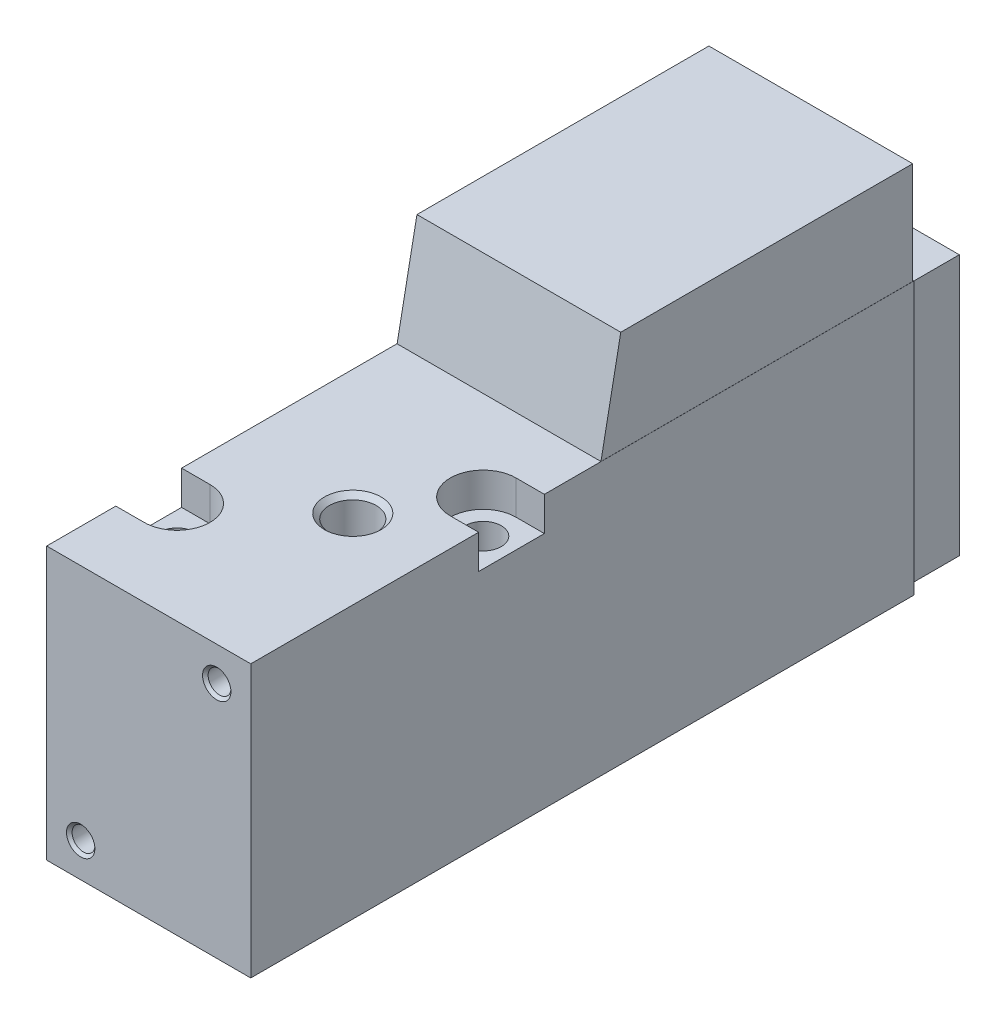
ISO-10303-21;
HEADER;
FILE_DESCRIPTION(('STEP AP214'),'2;1');
FILE_NAME('part.step','',(''),(''),'','','');
FILE_SCHEMA(('AUTOMOTIVE_DESIGN { 1 0 10303 214 1 1 1 1 }'));
ENDSEC;
DATA;
#1=APPLICATION_CONTEXT('core data for automotive mechanical design processes');
#2=APPLICATION_PROTOCOL_DEFINITION('international standard','automotive_design',2000,#1);
#3=PRODUCT_CONTEXT('',#1,'mechanical');
#4=PRODUCT('Part','Part','',(#3));
#5=PRODUCT_RELATED_PRODUCT_CATEGORY('part','',(#4));
#6=PRODUCT_DEFINITION_FORMATION('','',#4);
#7=PRODUCT_DEFINITION_CONTEXT('part definition',#1,'design');
#8=PRODUCT_DEFINITION('design','',#6,#7);
#9=PRODUCT_DEFINITION_SHAPE('','',#8);
#10=(LENGTH_UNIT() NAMED_UNIT(*) SI_UNIT(.MILLI.,.METRE.));
#11=(NAMED_UNIT(*) PLANE_ANGLE_UNIT() SI_UNIT($,.RADIAN.));
#12=(NAMED_UNIT(*) SI_UNIT($,.STERADIAN.) SOLID_ANGLE_UNIT());
#13=UNCERTAINTY_MEASURE_WITH_UNIT(LENGTH_MEASURE(1.E-05),#10,'distance_accuracy_value','');
#14=(GEOMETRIC_REPRESENTATION_CONTEXT(3) GLOBAL_UNCERTAINTY_ASSIGNED_CONTEXT((#13)) GLOBAL_UNIT_ASSIGNED_CONTEXT((#10,
#11,#12)) REPRESENTATION_CONTEXT('',''));
#15=CARTESIAN_POINT('',(0.,0.,0.));
#16=DIRECTION('',(0.,0.,1.));
#17=DIRECTION('',(1.,0.,0.));
#18=AXIS2_PLACEMENT_3D('',#15,#16,#17);
#19=CARTESIAN_POINT('',(0.,-6.5,-20.9675));
#20=DIRECTION('',(0.,1.,0.));
#21=DIRECTION('',(0.,0.,1.));
#22=AXIS2_PLACEMENT_3D('',#19,#20,#21);
#23=PLANE('',#22);
#24=CARTESIAN_POINT('',(0.,-6.5,-22.));
#25=DIRECTION('',(0.,1.,0.));
#26=DIRECTION('',(0.,0.,1.));
#27=AXIS2_PLACEMENT_3D('',#24,#25,#26);
#28=CIRCLE('',#27,2.065);
#29=CARTESIAN_POINT('',(0.,-6.5,-19.935));
#30=VERTEX_POINT('',#29);
#31=EDGE_CURVE('E18',#30,#30,#28,.F.);
#32=ORIENTED_EDGE('',*,*,#31,.T.);
#33=EDGE_LOOP('',(#32));
#34=FACE_BOUND('',#33,.T.);
#35=ADVANCED_FACE('F15',(#34),#23,.F.);
#36=CARTESIAN_POINT('',(0.,-6.5,-10.6675));
#37=DIRECTION('',(0.,1.,0.));
#38=DIRECTION('',(0.,0.,1.));
#39=AXIS2_PLACEMENT_3D('',#36,#37,#38);
#40=PLANE('',#39);
#41=CARTESIAN_POINT('',(0.,-6.5,-11.7));
#42=DIRECTION('',(0.,1.,0.));
#43=DIRECTION('',(0.,0.,1.));
#44=AXIS2_PLACEMENT_3D('',#41,#42,#43);
#45=CIRCLE('',#44,2.065);
#46=CARTESIAN_POINT('',(0.,-6.5,-9.635));
#47=VERTEX_POINT('',#46);
#48=EDGE_CURVE('E285',#47,#47,#45,.F.);
#49=ORIENTED_EDGE('',*,*,#48,.T.);
#50=EDGE_LOOP('',(#49));
#51=FACE_BOUND('',#50,.T.);
#52=ADVANCED_FACE('F487',(#51),#40,.F.);
#53=CARTESIAN_POINT('',(6.,9.,-3.00000000009959));
#54=DIRECTION('',(0.,0.,1.));
#55=DIRECTION('',(1.,0.,0.));
#56=AXIS2_PLACEMENT_3D('',#53,#54,#55);
#57=CONICAL_SURFACE('',#56,1.00499999982139,1.04719755088058);
#58=CARTESIAN_POINT('',(6.,9.,-3.));
#59=DIRECTION('',(0.,0.,-1.));
#60=DIRECTION('',(-1.,0.,0.));
#61=AXIS2_PLACEMENT_3D('',#58,#59,#60);
#62=CIRCLE('',#61,1.005);
#63=CARTESIAN_POINT('',(4.995,9.,-3.));
#64=VERTEX_POINT('',#63);
#65=EDGE_CURVE('E282',#64,#64,#62,.F.);
#66=ORIENTED_EDGE('',*,*,#65,.T.);
#67=EDGE_LOOP('',(#66));
#68=FACE_BOUND('',#67,.T.);
#69=CARTESIAN_POINT('',(5.99999999968759,9.,-3.58023702062837));
#70=VERTEX_POINT('',#69);
#71=VERTEX_LOOP('',#70);
#72=FACE_BOUND('',#71,.T.);
#73=ADVANCED_FACE('F484',(#68,#72),#57,.F.);
#74=CARTESIAN_POINT('',(-6.,-9.,-3.00000000004275));
#75=DIRECTION('',(0.,0.,1.));
#76=DIRECTION('',(0.,-1.,0.));
#77=AXIS2_PLACEMENT_3D('',#74,#75,#76);
#78=CONICAL_SURFACE('',#77,1.00499999999238,1.04719755111932);
#79=CARTESIAN_POINT('',(-6.,-9.,-3.));
#80=DIRECTION('',(0.,0.,-1.));
#81=DIRECTION('',(-1.,0.,0.));
#82=AXIS2_PLACEMENT_3D('',#79,#80,#81);
#83=CIRCLE('',#82,1.005);
#84=CARTESIAN_POINT('',(-7.005,-9.,-3.));
#85=VERTEX_POINT('',#84);
#86=EDGE_CURVE('E279',#85,#85,#83,.F.);
#87=ORIENTED_EDGE('',*,*,#86,.T.);
#88=EDGE_LOOP('',(#87));
#89=FACE_BOUND('',#88,.T.);
#90=CARTESIAN_POINT('',(-6.00000000014234,-9.,-3.58023702059995));
#91=VERTEX_POINT('',#90);
#92=VERTEX_LOOP('',#91);
#93=FACE_BOUND('',#92,.T.);
#94=ADVANCED_FACE('F480',(#89,#93),#78,.F.);
#95=CARTESIAN_POINT('',(2.,6.5,-14.9675));
#96=DIRECTION('',(0.,-1.,0.));
#97=DIRECTION('',(0.,0.,-1.));
#98=AXIS2_PLACEMENT_3D('',#95,#96,#97);
#99=PLANE('',#98);
#100=CARTESIAN_POINT('',(2.,6.5,-16.));
#101=DIRECTION('',(0.,1.,0.));
#102=DIRECTION('',(0.,0.,1.));
#103=AXIS2_PLACEMENT_3D('',#100,#101,#102);
#104=CIRCLE('',#103,2.065);
#105=CARTESIAN_POINT('',(2.,6.5,-13.935));
#106=VERTEX_POINT('',#105);
#107=EDGE_CURVE('E244',#106,#106,#104,.T.);
#108=ORIENTED_EDGE('',*,*,#107,.T.);
#109=EDGE_LOOP('',(#108));
#110=FACE_BOUND('',#109,.T.);
#111=ADVANCED_FACE('F476',(#110),#99,.F.);
#112=CARTESIAN_POINT('',(0.,0.,-63.));
#113=DIRECTION('',(0.,0.,1.));
#114=DIRECTION('',(1.,0.,0.));
#115=AXIS2_PLACEMENT_3D('',#112,#113,#114);
#116=PLANE('',#115);
#117=DIRECTION('',(1.,0.,0.));
#118=VECTOR('',#117,1.);
#119=CARTESIAN_POINT('',(-8.5,-11.5,-63.));
#120=LINE('',#119,#118);
#121=CARTESIAN_POINT('',(-8.5,-11.5,-63.));
#122=VERTEX_POINT('',#121);
#123=CARTESIAN_POINT('',(8.5,-11.5,-63.));
#124=VERTEX_POINT('',#123);
#125=EDGE_CURVE('E241',#122,#124,#120,.T.);
#126=ORIENTED_EDGE('',*,*,#125,.F.);
#127=DIRECTION('',(0.,1.,0.));
#128=VECTOR('',#127,1.);
#129=CARTESIAN_POINT('',(-8.5,11.5,-63.));
#130=LINE('',#129,#128);
#131=CARTESIAN_POINT('',(-8.5,11.5,-63.));
#132=VERTEX_POINT('',#131);
#133=EDGE_CURVE('E238',#132,#122,#130,.F.);
#134=ORIENTED_EDGE('',*,*,#133,.F.);
#135=DIRECTION('',(1.,0.,0.));
#136=VECTOR('',#135,1.);
#137=CARTESIAN_POINT('',(8.5,11.5,-63.));
#138=LINE('',#137,#136);
#139=CARTESIAN_POINT('',(8.5,11.5,-63.));
#140=VERTEX_POINT('',#139);
#141=EDGE_CURVE('E232',#140,#132,#138,.F.);
#142=ORIENTED_EDGE('',*,*,#141,.F.);
#143=DIRECTION('',(0.,1.,0.));
#144=VECTOR('',#143,1.);
#145=CARTESIAN_POINT('',(8.5,-11.5,-63.));
#146=LINE('',#145,#144);
#147=EDGE_CURVE('E226',#124,#140,#146,.T.);
#148=ORIENTED_EDGE('',*,*,#147,.F.);
#149=EDGE_LOOP('',(#126,#134,#142,#148));
#150=FACE_BOUND('',#149,.T.);
#151=ADVANCED_FACE('F341',(#150),#116,.F.);
#152=CARTESIAN_POINT('',(0.,-9.0025,-22.));
#153=DIRECTION('',(0.,1.,0.));
#154=DIRECTION('',(0.,0.,1.));
#155=AXIS2_PLACEMENT_3D('',#152,#153,#154);
#156=CYLINDRICAL_SURFACE('',#155,2.065);
#157=ORIENTED_EDGE('',*,*,#31,.F.);
#158=EDGE_LOOP('',(#157));
#159=FACE_BOUND('',#158,.T.);
#160=CARTESIAN_POINT('',(0.,-11.5049999999428,-22.));
#161=DIRECTION('',(0.,-1.,0.));
#162=DIRECTION('',(0.,0.,1.));
#163=AXIS2_PLACEMENT_3D('',#160,#161,#162);
#164=CIRCLE('',#163,2.06499999996777);
#165=CARTESIAN_POINT('',(0.,-11.5049999999428,-19.9350000000322));
#166=VERTEX_POINT('',#165);
#167=EDGE_CURVE('E276',#166,#166,#164,.T.);
#168=ORIENTED_EDGE('',*,*,#167,.T.);
#169=EDGE_LOOP('',(#168));
#170=FACE_BOUND('',#169,.T.);
#171=ADVANCED_FACE('F337',(#159,#170),#156,.F.);
#172=CARTESIAN_POINT('',(0.,-9.0025,-11.7));
#173=DIRECTION('',(0.,1.,0.));
#174=DIRECTION('',(0.,0.,1.));
#175=AXIS2_PLACEMENT_3D('',#172,#173,#174);
#176=CYLINDRICAL_SURFACE('',#175,2.065);
#177=ORIENTED_EDGE('',*,*,#48,.F.);
#178=EDGE_LOOP('',(#177));
#179=FACE_BOUND('',#178,.T.);
#180=CARTESIAN_POINT('',(0.,-11.5049999999997,-11.7));
#181=DIRECTION('',(0.,-1.,0.));
#182=DIRECTION('',(0.,0.,1.));
#183=AXIS2_PLACEMENT_3D('',#180,#181,#182);
#184=CIRCLE('',#183,2.06499999999705);
#185=CARTESIAN_POINT('',(0.,-11.5049999999997,-9.63500000000295));
#186=VERTEX_POINT('',#185);
#187=EDGE_CURVE('E273',#186,#186,#184,.T.);
#188=ORIENTED_EDGE('',*,*,#187,.T.);
#189=EDGE_LOOP('',(#188));
#190=FACE_BOUND('',#189,.T.);
#191=ADVANCED_FACE('F340',(#179,#190),#176,.F.);
#192=CARTESIAN_POINT('',(6.,9.,-1.6225));
#193=DIRECTION('',(0.,0.,-1.));
#194=DIRECTION('',(-1.,0.,0.));
#195=AXIS2_PLACEMENT_3D('',#192,#193,#194);
#196=CYLINDRICAL_SURFACE('',#195,1.005);
#197=ORIENTED_EDGE('',*,*,#65,.F.);
#198=EDGE_LOOP('',(#197));
#199=FACE_BOUND('',#198,.T.);
#200=CARTESIAN_POINT('',(6.,9.,-0.245000000006712));
#201=DIRECTION('',(0.,0.,1.));
#202=DIRECTION('',(-1.,0.,0.));
#203=AXIS2_PLACEMENT_3D('',#200,#201,#202);
#204=CIRCLE('',#203,1.00499999999192);
#205=CARTESIAN_POINT('',(4.99500000000808,9.,-0.245000000006712));
#206=VERTEX_POINT('',#205);
#207=EDGE_CURVE('E270',#206,#206,#204,.T.);
#208=ORIENTED_EDGE('',*,*,#207,.T.);
#209=EDGE_LOOP('',(#208));
#210=FACE_BOUND('',#209,.T.);
#211=ADVANCED_FACE('F463',(#199,#210),#196,.F.);
#212=CARTESIAN_POINT('',(-6.,-9.,-1.6225));
#213=DIRECTION('',(0.,0.,-1.));
#214=DIRECTION('',(-1.,0.,0.));
#215=AXIS2_PLACEMENT_3D('',#212,#213,#214);
#216=CYLINDRICAL_SURFACE('',#215,1.005);
#217=ORIENTED_EDGE('',*,*,#86,.F.);
#218=EDGE_LOOP('',(#217));
#219=FACE_BOUND('',#218,.T.);
#220=CARTESIAN_POINT('',(-6.,-9.,-0.244999999949869));
#221=DIRECTION('',(0.,0.,1.));
#222=DIRECTION('',(-1.,0.,0.));
#223=AXIS2_PLACEMENT_3D('',#220,#221,#222);
#224=CIRCLE('',#223,1.00500000004922);
#225=CARTESIAN_POINT('',(-7.00500000004922,-9.,-0.244999999949869));
#226=VERTEX_POINT('',#225);
#227=EDGE_CURVE('E218',#226,#226,#224,.T.);
#228=ORIENTED_EDGE('',*,*,#227,.T.);
#229=EDGE_LOOP('',(#228));
#230=FACE_BOUND('',#229,.T.);
#231=ADVANCED_FACE('F469',(#219,#230),#216,.F.);
#232=CARTESIAN_POINT('',(8.99,21.,-58.4));
#233=DIRECTION('',(0.,1.,0.));
#234=DIRECTION('',(0.,0.,1.));
#235=AXIS2_PLACEMENT_3D('',#232,#233,#234);
#236=PLANE('',#235);
#237=DIRECTION('',(0.,0.,-1.));
#238=VECTOR('',#237,1.);
#239=CARTESIAN_POINT('',(8.99,21.,0.));
#240=LINE('',#239,#238);
#241=CARTESIAN_POINT('',(8.99,21.,-58.4));
#242=VERTEX_POINT('',#241);
#243=CARTESIAN_POINT('',(8.99,21.,-32.6494227822395));
#244=VERTEX_POINT('',#243);
#245=EDGE_CURVE('E200',#242,#244,#240,.F.);
#246=ORIENTED_EDGE('',*,*,#245,.F.);
#247=DIRECTION('',(-1.,0.,0.));
#248=VECTOR('',#247,1.);
#249=CARTESIAN_POINT('',(8.99,21.,-58.4));
#250=LINE('',#249,#248);
#251=CARTESIAN_POINT('',(-8.99,21.,-58.4));
#252=VERTEX_POINT('',#251);
#253=EDGE_CURVE('E206',#252,#242,#250,.F.);
#254=ORIENTED_EDGE('',*,*,#253,.F.);
#255=DIRECTION('',(0.,0.,-1.));
#256=VECTOR('',#255,1.);
#257=CARTESIAN_POINT('',(-8.99,21.,0.));
#258=LINE('',#257,#256);
#259=CARTESIAN_POINT('',(-8.99,21.,-32.6494227822395));
#260=VERTEX_POINT('',#259);
#261=EDGE_CURVE('E213',#252,#260,#258,.F.);
#262=ORIENTED_EDGE('',*,*,#261,.T.);
#263=DIRECTION('',(1.,0.,0.));
#264=VECTOR('',#263,1.);
#265=CARTESIAN_POINT('',(8.99,21.,-32.6494227822395));
#266=LINE('',#265,#264);
#267=EDGE_CURVE('E215',#244,#260,#266,.F.);
#268=ORIENTED_EDGE('',*,*,#267,.F.);
#269=EDGE_LOOP('',(#246,#254,#262,#268));
#270=FACE_BOUND('',#269,.T.);
#271=ADVANCED_FACE('F535',(#270),#236,.T.);
#272=CARTESIAN_POINT('',(2.,9.03250000000001,-16.));
#273=DIRECTION('',(0.,1.,0.));
#274=DIRECTION('',(0.,0.,1.));
#275=AXIS2_PLACEMENT_3D('',#272,#273,#274);
#276=CYLINDRICAL_SURFACE('',#275,2.065);
#277=ORIENTED_EDGE('',*,*,#107,.F.);
#278=EDGE_LOOP('',(#277));
#279=FACE_BOUND('',#278,.T.);
#280=CARTESIAN_POINT('',(2.,11.5649999999619,-16.));
#281=DIRECTION('',(0.,1.,0.));
#282=DIRECTION('',(0.,0.,1.));
#283=AXIS2_PLACEMENT_3D('',#280,#281,#282);
#284=CIRCLE('',#283,2.06499999999642);
#285=CARTESIAN_POINT('',(2.,11.5649999999619,-13.9350000000036));
#286=VERTEX_POINT('',#285);
#287=EDGE_CURVE('E174',#286,#286,#284,.T.);
#288=ORIENTED_EDGE('',*,*,#287,.T.);
#289=EDGE_LOOP('',(#288));
#290=FACE_BOUND('',#289,.T.);
#291=ADVANCED_FACE('F542',(#279,#290),#276,.F.);
#292=CARTESIAN_POINT('',(0.,9.,0.));
#293=DIRECTION('',(0.,1.,0.));
#294=DIRECTION('',(0.,0.,1.));
#295=AXIS2_PLACEMENT_3D('',#292,#293,#294);
#296=PLANE('',#295);
#297=CARTESIAN_POINT('',(6.5,9.,-23.));
#298=DIRECTION('',(0.,1.,0.));
#299=DIRECTION('',(0.,0.,1.));
#300=AXIS2_PLACEMENT_3D('',#297,#298,#299);
#301=CIRCLE('',#300,2.9);
#302=CARTESIAN_POINT('',(6.5,9.,-25.9));
#303=VERTEX_POINT('',#302);
#304=CARTESIAN_POINT('',(6.5,9.,-20.1));
#305=VERTEX_POINT('',#304);
#306=EDGE_CURVE('E157',#303,#305,#301,.T.);
#307=ORIENTED_EDGE('',*,*,#306,.T.);
#308=DIRECTION('',(1.,0.,0.));
#309=VECTOR('',#308,1.);
#310=CARTESIAN_POINT('',(6.5,9.,-20.1));
#311=LINE('',#310,#309);
#312=CARTESIAN_POINT('',(9.,9.,-20.1));
#313=VERTEX_POINT('',#312);
#314=EDGE_CURVE('E161',#305,#313,#311,.T.);
#315=ORIENTED_EDGE('',*,*,#314,.T.);
#316=DIRECTION('',(0.,0.,-1.));
#317=VECTOR('',#316,1.);
#318=CARTESIAN_POINT('',(9.,9.,0.));
#319=LINE('',#318,#317);
#320=CARTESIAN_POINT('',(9.,9.,-25.9));
#321=VERTEX_POINT('',#320);
#322=EDGE_CURVE('E259',#321,#313,#319,.F.);
#323=ORIENTED_EDGE('',*,*,#322,.F.);
#324=DIRECTION('',(-1.,0.,0.));
#325=VECTOR('',#324,1.);
#326=CARTESIAN_POINT('',(10.,9.,-25.9));
#327=LINE('',#326,#325);
#328=EDGE_CURVE('E155',#321,#303,#327,.T.);
#329=ORIENTED_EDGE('',*,*,#328,.T.);
#330=EDGE_LOOP('',(#307,#315,#323,#329));
#331=FACE_BOUND('',#330,.T.);
#332=CARTESIAN_POINT('',(6.49999999999999,9.,-23.));
#333=DIRECTION('',(0.,1.,0.));
#334=DIRECTION('',(0.,0.,1.));
#335=AXIS2_PLACEMENT_3D('',#332,#333,#334);
#336=CIRCLE('',#335,1.6);
#337=CARTESIAN_POINT('',(6.49999999999999,9.,-21.4));
#338=VERTEX_POINT('',#337);
#339=EDGE_CURVE('E222',#338,#338,#336,.F.);
#340=ORIENTED_EDGE('',*,*,#339,.T.);
#341=EDGE_LOOP('',(#340));
#342=FACE_BOUND('',#341,.T.);
#343=ADVANCED_FACE('F159',(#331,#342),#296,.T.);
#344=CARTESIAN_POINT('',(-8.5,-11.5,-58.5));
#345=DIRECTION('',(0.,-1.,0.));
#346=DIRECTION('',(0.,0.,-1.));
#347=AXIS2_PLACEMENT_3D('',#344,#345,#346);
#348=PLANE('',#347);
#349=DIRECTION('',(1.,0.,0.));
#350=VECTOR('',#349,1.);
#351=CARTESIAN_POINT('',(0.,-11.5,-58.5));
#352=LINE('',#351,#350);
#353=CARTESIAN_POINT('',(8.5,-11.5,-58.5));
#354=VERTEX_POINT('',#353);
#355=CARTESIAN_POINT('',(-8.5,-11.5,-58.5));
#356=VERTEX_POINT('',#355);
#357=EDGE_CURVE('E247',#354,#356,#352,.F.);
#358=ORIENTED_EDGE('',*,*,#357,.T.);
#359=DIRECTION('',(0.,0.,1.));
#360=VECTOR('',#359,1.);
#361=CARTESIAN_POINT('',(-8.5,-11.5,-58.5));
#362=LINE('',#361,#360);
#363=EDGE_CURVE('E235',#122,#356,#362,.T.);
#364=ORIENTED_EDGE('',*,*,#363,.F.);
#365=ORIENTED_EDGE('',*,*,#125,.T.);
#366=DIRECTION('',(0.,0.,-1.));
#367=VECTOR('',#366,1.);
#368=CARTESIAN_POINT('',(8.5,-11.5,-58.5));
#369=LINE('',#368,#367);
#370=EDGE_CURVE('E219',#354,#124,#369,.T.);
#371=ORIENTED_EDGE('',*,*,#370,.F.);
#372=EDGE_LOOP('',(#358,#364,#365,#371));
#373=FACE_BOUND('',#372,.T.);
#374=ADVANCED_FACE('F557',(#373),#348,.T.);
#375=CARTESIAN_POINT('',(-8.5,11.5,-58.5));
#376=DIRECTION('',(-1.,0.,0.));
#377=DIRECTION('',(0.,0.,1.));
#378=AXIS2_PLACEMENT_3D('',#375,#376,#377);
#379=PLANE('',#378);
#380=DIRECTION('',(0.,1.,0.));
#381=VECTOR('',#380,1.);
#382=CARTESIAN_POINT('',(-8.5,0.,-58.5));
#383=LINE('',#382,#381);
#384=CARTESIAN_POINT('',(-8.5,11.5,-58.5));
#385=VERTEX_POINT('',#384);
#386=EDGE_CURVE('E683',#356,#385,#383,.T.);
#387=ORIENTED_EDGE('',*,*,#386,.T.);
#388=DIRECTION('',(0.,0.,1.));
#389=VECTOR('',#388,1.);
#390=CARTESIAN_POINT('',(-8.5,11.5,-58.5));
#391=LINE('',#390,#389);
#392=EDGE_CURVE('E229',#132,#385,#391,.T.);
#393=ORIENTED_EDGE('',*,*,#392,.F.);
#394=ORIENTED_EDGE('',*,*,#133,.T.);
#395=ORIENTED_EDGE('',*,*,#363,.T.);
#396=EDGE_LOOP('',(#387,#393,#394,#395));
#397=FACE_BOUND('',#396,.T.);
#398=ADVANCED_FACE('F564',(#397),#379,.T.);
#399=CARTESIAN_POINT('',(8.5,11.5,-58.5));
#400=DIRECTION('',(0.,1.,0.));
#401=DIRECTION('',(0.,0.,1.));
#402=AXIS2_PLACEMENT_3D('',#399,#400,#401);
#403=PLANE('',#402);
#404=DIRECTION('',(1.,0.,0.));
#405=VECTOR('',#404,1.);
#406=CARTESIAN_POINT('',(0.,11.5,-58.5));
#407=LINE('',#406,#405);
#408=CARTESIAN_POINT('',(8.5,11.5,-58.5));
#409=VERTEX_POINT('',#408);
#410=EDGE_CURVE('E677',#385,#409,#407,.T.);
#411=ORIENTED_EDGE('',*,*,#410,.T.);
#412=DIRECTION('',(0.,0.,-1.));
#413=VECTOR('',#412,1.);
#414=CARTESIAN_POINT('',(8.5,11.5,-58.5));
#415=LINE('',#414,#413);
#416=EDGE_CURVE('E223',#140,#409,#415,.F.);
#417=ORIENTED_EDGE('',*,*,#416,.F.);
#418=ORIENTED_EDGE('',*,*,#141,.T.);
#419=ORIENTED_EDGE('',*,*,#392,.T.);
#420=EDGE_LOOP('',(#411,#417,#418,#419));
#421=FACE_BOUND('',#420,.T.);
#422=ADVANCED_FACE('F376',(#421),#403,.T.);
#423=CARTESIAN_POINT('',(8.5,-11.5,-58.5));
#424=DIRECTION('',(1.,0.,0.));
#425=DIRECTION('',(0.,0.,-1.));
#426=AXIS2_PLACEMENT_3D('',#423,#424,#425);
#427=PLANE('',#426);
#428=DIRECTION('',(0.,1.,0.));
#429=VECTOR('',#428,1.);
#430=CARTESIAN_POINT('',(8.5,0.,-58.5));
#431=LINE('',#430,#429);
#432=EDGE_CURVE('E682',#409,#354,#431,.F.);
#433=ORIENTED_EDGE('',*,*,#432,.T.);
#434=ORIENTED_EDGE('',*,*,#370,.T.);
#435=ORIENTED_EDGE('',*,*,#147,.T.);
#436=ORIENTED_EDGE('',*,*,#416,.T.);
#437=EDGE_LOOP('',(#433,#434,#435,#436));
#438=FACE_BOUND('',#437,.T.);
#439=ADVANCED_FACE('F366',(#438),#427,.T.);
#440=CARTESIAN_POINT('',(6.49999999999999,9.,-23.));
#441=DIRECTION('',(0.,1.,0.));
#442=DIRECTION('',(0.,0.,1.));
#443=AXIS2_PLACEMENT_3D('',#440,#441,#442);
#444=CYLINDRICAL_SURFACE('',#443,1.6);
#445=ORIENTED_EDGE('',*,*,#339,.F.);
#446=EDGE_LOOP('',(#445));
#447=FACE_BOUND('',#446,.T.);
#448=CARTESIAN_POINT('',(6.49999999999999,-12.,-23.));
#449=DIRECTION('',(0.,1.,0.));
#450=DIRECTION('',(0.,0.,1.));
#451=AXIS2_PLACEMENT_3D('',#448,#449,#450);
#452=CIRCLE('',#451,1.6);
#453=CARTESIAN_POINT('',(6.49999999999999,-12.,-21.4));
#454=VERTEX_POINT('',#453);
#455=EDGE_CURVE('E316',#454,#454,#452,.T.);
#456=ORIENTED_EDGE('',*,*,#455,.F.);
#457=EDGE_LOOP('',(#456));
#458=FACE_BOUND('',#457,.T.);
#459=ADVANCED_FACE('F364',(#447,#458),#444,.F.);
#460=CARTESIAN_POINT('',(-6.5,9.,-9.));
#461=DIRECTION('',(0.,1.,0.));
#462=DIRECTION('',(0.,0.,1.));
#463=AXIS2_PLACEMENT_3D('',#460,#461,#462);
#464=CYLINDRICAL_SURFACE('',#463,1.6);
#465=CARTESIAN_POINT('',(-6.5,9.,-9.));
#466=DIRECTION('',(0.,1.,0.));
#467=DIRECTION('',(0.,0.,1.));
#468=AXIS2_PLACEMENT_3D('',#465,#466,#467);
#469=CIRCLE('',#468,1.6);
#470=CARTESIAN_POINT('',(-6.5,9.,-7.4));
#471=VERTEX_POINT('',#470);
#472=EDGE_CURVE('E324',#471,#471,#469,.F.);
#473=ORIENTED_EDGE('',*,*,#472,.F.);
#474=EDGE_LOOP('',(#473));
#475=FACE_BOUND('',#474,.T.);
#476=CARTESIAN_POINT('',(-6.5,-12.,-9.));
#477=DIRECTION('',(0.,1.,0.));
#478=DIRECTION('',(0.,0.,1.));
#479=AXIS2_PLACEMENT_3D('',#476,#477,#478);
#480=CIRCLE('',#479,1.6);
#481=CARTESIAN_POINT('',(-6.5,-12.,-7.4));
#482=VERTEX_POINT('',#481);
#483=EDGE_CURVE('E313',#482,#482,#480,.T.);
#484=ORIENTED_EDGE('',*,*,#483,.F.);
#485=EDGE_LOOP('',(#484));
#486=FACE_BOUND('',#485,.T.);
#487=ADVANCED_FACE('F349',(#475,#486),#464,.F.);
#488=CARTESIAN_POINT('',(0.,-12.0000000000573,-22.));
#489=DIRECTION('',(0.,-1.,0.));
#490=DIRECTION('',(0.,0.,-1.));
#491=AXIS2_PLACEMENT_3D('',#488,#489,#490);
#492=CONICAL_SURFACE('',#491,2.56000000008225,0.785398163397448);
#493=ORIENTED_EDGE('',*,*,#167,.F.);
#494=EDGE_LOOP('',(#493));
#495=FACE_BOUND('',#494,.T.);
#496=CARTESIAN_POINT('',(0.,-12.0000000000005,-22.));
#497=DIRECTION('',(0.,-1.,0.));
#498=DIRECTION('',(0.,0.,-1.));
#499=AXIS2_PLACEMENT_3D('',#496,#497,#498);
#500=CIRCLE('',#499,2.56000000002541);
#501=CARTESIAN_POINT('',(0.,-12.0000000000005,-24.5600000000254));
#502=VERTEX_POINT('',#501);
#503=EDGE_CURVE('E310',#502,#502,#500,.F.);
#504=ORIENTED_EDGE('',*,*,#503,.F.);
#505=EDGE_LOOP('',(#504));
#506=FACE_BOUND('',#505,.T.);
#507=ADVANCED_FACE('F345',(#495,#506),#492,.F.);
#508=CARTESIAN_POINT('',(0.,-12.0000000000573,-11.7));
#509=DIRECTION('',(0.,-1.,0.));
#510=DIRECTION('',(0.,0.,-1.));
#511=AXIS2_PLACEMENT_3D('',#508,#509,#510);
#512=CONICAL_SURFACE('',#511,2.55999999999785,0.785398163340031);
#513=ORIENTED_EDGE('',*,*,#187,.F.);
#514=EDGE_LOOP('',(#513));
#515=FACE_BOUND('',#514,.T.);
#516=CARTESIAN_POINT('',(0.,-12.0000000000573,-11.7));
#517=DIRECTION('',(0.,-1.,0.));
#518=DIRECTION('',(0.,0.,-1.));
#519=AXIS2_PLACEMENT_3D('',#516,#517,#518);
#520=CIRCLE('',#519,2.55999999999785);
#521=CARTESIAN_POINT('',(0.,-12.0000000000573,-14.2599999999979));
#522=VERTEX_POINT('',#521);
#523=EDGE_CURVE('E306',#522,#522,#520,.F.);
#524=ORIENTED_EDGE('',*,*,#523,.F.);
#525=EDGE_LOOP('',(#524));
#526=FACE_BOUND('',#525,.T.);
#527=ADVANCED_FACE('F348',(#515,#526),#512,.F.);
#528=CARTESIAN_POINT('',(6.,9.,-5.6843418860808E-11));
#529=DIRECTION('',(0.,0.,1.));
#530=DIRECTION('',(1.,0.,0.));
#531=AXIS2_PLACEMENT_3D('',#528,#529,#530);
#532=CONICAL_SURFACE('',#531,1.24999999994179,0.785398163513455);
#533=ORIENTED_EDGE('',*,*,#207,.F.);
#534=EDGE_LOOP('',(#533));
#535=FACE_BOUND('',#534,.T.);
#536=CARTESIAN_POINT('',(6.,9.,-2.8194460661698E-11));
#537=DIRECTION('',(0.,0.,1.));
#538=DIRECTION('',(1.,0.,0.));
#539=AXIS2_PLACEMENT_3D('',#536,#537,#538);
#540=CIRCLE('',#539,1.24999999997044);
#541=CARTESIAN_POINT('',(7.24999999997044,9.,-2.8194460661698E-11));
#542=VERTEX_POINT('',#541);
#543=EDGE_CURVE('E302',#542,#542,#540,.F.);
#544=ORIENTED_EDGE('',*,*,#543,.F.);
#545=EDGE_LOOP('',(#544));
#546=FACE_BOUND('',#545,.T.);
#547=ADVANCED_FACE('F448',(#535,#546),#532,.F.);
#548=CARTESIAN_POINT('',(-6.,-9.,-1.13686837721616E-10));
#549=DIRECTION('',(0.,0.,1.));
#550=DIRECTION('',(1.,0.,0.));
#551=AXIS2_PLACEMENT_3D('',#548,#549,#550);
#552=CONICAL_SURFACE('',#551,1.24999999994225,0.785398163397448);
#553=ORIENTED_EDGE('',*,*,#227,.F.);
#554=EDGE_LOOP('',(#553));
#555=FACE_BOUND('',#554,.T.);
#556=CARTESIAN_POINT('',(-6.,-9.,-5.6843418860808E-11));
#557=DIRECTION('',(0.,0.,1.));
#558=DIRECTION('',(1.,0.,0.));
#559=AXIS2_PLACEMENT_3D('',#556,#557,#558);
#560=CIRCLE('',#559,1.24999999999909);
#561=CARTESIAN_POINT('',(-4.75000000000091,-9.,-5.6843418860808E-11));
#562=VERTEX_POINT('',#561);
#563=EDGE_CURVE('E298',#562,#562,#560,.F.);
#564=ORIENTED_EDGE('',*,*,#563,.F.);
#565=EDGE_LOOP('',(#564));
#566=FACE_BOUND('',#565,.T.);
#567=ADVANCED_FACE('F444',(#555,#566),#552,.F.);
#568=CARTESIAN_POINT('',(8.99,21.,-32.6494227822395));
#569=DIRECTION('',(0.,0.190808995376545,0.981627183447664));
#570=DIRECTION('',(0.,-0.981627183447664,0.190808995376545));
#571=AXIS2_PLACEMENT_3D('',#568,#569,#570);
#572=PLANE('',#571);
#573=DIRECTION('',(0.,-0.981627183447663,0.190808995376548));
#574=VECTOR('',#573,1.);
#575=CARTESIAN_POINT('',(8.99,21.,-32.6494227822395));
#576=LINE('',#575,#574);
#577=CARTESIAN_POINT('',(8.99,12.,-30.9));
#578=VERTEX_POINT('',#577);
#579=EDGE_CURVE('E197',#244,#578,#576,.T.);
#580=ORIENTED_EDGE('',*,*,#579,.F.);
#581=ORIENTED_EDGE('',*,*,#267,.T.);
#582=DIRECTION('',(0.,-0.981627183447663,0.190808995376548));
#583=VECTOR('',#582,1.);
#584=CARTESIAN_POINT('',(-8.99,21.,-32.6494227822395));
#585=LINE('',#584,#583);
#586=CARTESIAN_POINT('',(-8.99,12.,-30.9));
#587=VERTEX_POINT('',#586);
#588=EDGE_CURVE('E211',#260,#587,#585,.T.);
#589=ORIENTED_EDGE('',*,*,#588,.T.);
#590=DIRECTION('',(1.,0.,0.));
#591=VECTOR('',#590,1.);
#592=CARTESIAN_POINT('',(9.,12.,-30.9));
#593=LINE('',#592,#591);
#594=EDGE_CURVE('E742',#578,#587,#593,.F.);
#595=ORIENTED_EDGE('',*,*,#594,.F.);
#596=EDGE_LOOP('',(#580,#581,#589,#595));
#597=FACE_BOUND('',#596,.T.);
#598=ADVANCED_FACE('F440',(#597),#572,.T.);
#599=CARTESIAN_POINT('',(-8.99,0.,0.));
#600=DIRECTION('',(1.,0.,0.));
#601=DIRECTION('',(0.,0.,-1.));
#602=AXIS2_PLACEMENT_3D('',#599,#600,#601);
#603=PLANE('',#602);
#604=DIRECTION('',(0.,0.,1.));
#605=VECTOR('',#604,1.);
#606=CARTESIAN_POINT('',(-8.99,12.,0.));
#607=LINE('',#606,#605);
#608=CARTESIAN_POINT('',(-8.99,12.,-58.4));
#609=VERTEX_POINT('',#608);
#610=EDGE_CURVE('E739',#587,#609,#607,.F.);
#611=ORIENTED_EDGE('',*,*,#610,.F.);
#612=ORIENTED_EDGE('',*,*,#588,.F.);
#613=ORIENTED_EDGE('',*,*,#261,.F.);
#614=DIRECTION('',(0.,1.,0.));
#615=VECTOR('',#614,1.);
#616=CARTESIAN_POINT('',(-8.99,12.,-58.4));
#617=LINE('',#616,#615);
#618=EDGE_CURVE('E208',#609,#252,#617,.T.);
#619=ORIENTED_EDGE('',*,*,#618,.F.);
#620=EDGE_LOOP('',(#611,#612,#613,#619));
#621=FACE_BOUND('',#620,.T.);
#622=ADVANCED_FACE('F436',(#621),#603,.F.);
#623=CARTESIAN_POINT('',(8.99,12.,-58.4));
#624=DIRECTION('',(0.,0.,-1.));
#625=DIRECTION('',(-1.,0.,0.));
#626=AXIS2_PLACEMENT_3D('',#623,#624,#625);
#627=PLANE('',#626);
#628=DIRECTION('',(0.,1.,0.));
#629=VECTOR('',#628,1.);
#630=CARTESIAN_POINT('',(8.99,0.,-58.4));
#631=LINE('',#630,#629);
#632=CARTESIAN_POINT('',(8.99,12.,-58.4));
#633=VERTEX_POINT('',#632);
#634=EDGE_CURVE('E203',#633,#242,#631,.T.);
#635=ORIENTED_EDGE('',*,*,#634,.F.);
#636=DIRECTION('',(1.,0.,0.));
#637=VECTOR('',#636,1.);
#638=CARTESIAN_POINT('',(9.,12.,-58.4));
#639=LINE('',#638,#637);
#640=EDGE_CURVE('E736',#609,#633,#639,.T.);
#641=ORIENTED_EDGE('',*,*,#640,.F.);
#642=ORIENTED_EDGE('',*,*,#618,.T.);
#643=ORIENTED_EDGE('',*,*,#253,.T.);
#644=EDGE_LOOP('',(#635,#641,#642,#643));
#645=FACE_BOUND('',#644,.T.);
#646=ADVANCED_FACE('F432',(#645),#627,.T.);
#647=CARTESIAN_POINT('',(8.99,0.,0.));
#648=DIRECTION('',(1.,0.,0.));
#649=DIRECTION('',(0.,0.,-1.));
#650=AXIS2_PLACEMENT_3D('',#647,#648,#649);
#651=PLANE('',#650);
#652=ORIENTED_EDGE('',*,*,#245,.T.);
#653=ORIENTED_EDGE('',*,*,#579,.T.);
#654=DIRECTION('',(0.,0.,1.));
#655=VECTOR('',#654,1.);
#656=CARTESIAN_POINT('',(8.99,12.,0.));
#657=LINE('',#656,#655);
#658=EDGE_CURVE('E297',#633,#578,#657,.T.);
#659=ORIENTED_EDGE('',*,*,#658,.F.);
#660=ORIENTED_EDGE('',*,*,#634,.T.);
#661=EDGE_LOOP('',(#652,#653,#659,#660));
#662=FACE_BOUND('',#661,.T.);
#663=ADVANCED_FACE('F428',(#662),#651,.T.);
#664=CARTESIAN_POINT('',(2.,11.9999999999436,-16.));
#665=DIRECTION('',(0.,1.,0.));
#666=DIRECTION('',(0.,0.,1.));
#667=AXIS2_PLACEMENT_3D('',#664,#665,#666);
#668=CONICAL_SURFACE('',#667,2.50000000003502,0.785398163462786);
#669=ORIENTED_EDGE('',*,*,#287,.F.);
#670=EDGE_LOOP('',(#669));
#671=FACE_BOUND('',#670,.T.);
#672=CARTESIAN_POINT('',(2.,11.9999999999632,-16.));
#673=DIRECTION('',(0.,1.,0.));
#674=DIRECTION('',(0.,0.,1.));
#675=AXIS2_PLACEMENT_3D('',#672,#673,#674);
#676=CIRCLE('',#675,2.50000000005457);
#677=CARTESIAN_POINT('',(2.,11.9999999999632,-13.4999999999454));
#678=VERTEX_POINT('',#677);
#679=EDGE_CURVE('E294',#678,#678,#676,.F.);
#680=ORIENTED_EDGE('',*,*,#679,.F.);
#681=EDGE_LOOP('',(#680));
#682=FACE_BOUND('',#681,.T.);
#683=ADVANCED_FACE('F425',(#671,#682),#668,.F.);
#684=CARTESIAN_POINT('',(6.5,15.,-20.1));
#685=DIRECTION('',(0.,0.,1.));
#686=DIRECTION('',(1.,0.,0.));
#687=AXIS2_PLACEMENT_3D('',#684,#685,#686);
#688=PLANE('',#687);
#689=DIRECTION('',(0.,1.,0.));
#690=VECTOR('',#689,1.);
#691=CARTESIAN_POINT('',(9.,-12.,-20.1));
#692=LINE('',#691,#690);
#693=CARTESIAN_POINT('',(9.,12.,-20.1));
#694=VERTEX_POINT('',#693);
#695=EDGE_CURVE('E172',#313,#694,#692,.T.);
#696=ORIENTED_EDGE('',*,*,#695,.F.);
#697=ORIENTED_EDGE('',*,*,#314,.F.);
#698=DIRECTION('',(0.,1.,0.));
#699=VECTOR('',#698,1.);
#700=CARTESIAN_POINT('',(6.5,15.,-20.1));
#701=LINE('',#700,#699);
#702=CARTESIAN_POINT('',(6.5,12.,-20.1));
#703=VERTEX_POINT('',#702);
#704=EDGE_CURVE('E166',#305,#703,#701,.T.);
#705=ORIENTED_EDGE('',*,*,#704,.T.);
#706=DIRECTION('',(1.,0.,0.));
#707=VECTOR('',#706,1.);
#708=CARTESIAN_POINT('',(9.,12.,-20.1));
#709=LINE('',#708,#707);
#710=EDGE_CURVE('E293',#694,#703,#709,.F.);
#711=ORIENTED_EDGE('',*,*,#710,.F.);
#712=EDGE_LOOP('',(#696,#697,#705,#711));
#713=FACE_BOUND('',#712,.T.);
#714=ADVANCED_FACE('F169',(#713),#688,.F.);
#715=CARTESIAN_POINT('',(6.5,15.,-23.));
#716=DIRECTION('',(0.,1.,0.));
#717=DIRECTION('',(0.,0.,1.));
#718=AXIS2_PLACEMENT_3D('',#715,#716,#717);
#719=CYLINDRICAL_SURFACE('',#718,2.9);
#720=ORIENTED_EDGE('',*,*,#704,.F.);
#721=ORIENTED_EDGE('',*,*,#306,.F.);
#722=DIRECTION('',(0.,1.,0.));
#723=VECTOR('',#722,1.);
#724=CARTESIAN_POINT('',(6.49999999999999,15.,-25.9));
#725=LINE('',#724,#723);
#726=CARTESIAN_POINT('',(6.5,12.,-25.9));
#727=VERTEX_POINT('',#726);
#728=EDGE_CURVE('E181',#303,#727,#725,.T.);
#729=ORIENTED_EDGE('',*,*,#728,.T.);
#730=CARTESIAN_POINT('',(6.5,12.,-23.));
#731=DIRECTION('',(0.,1.,0.));
#732=DIRECTION('',(0.,0.,1.));
#733=AXIS2_PLACEMENT_3D('',#730,#731,#732);
#734=CIRCLE('',#733,2.9);
#735=EDGE_CURVE('E178',#703,#727,#734,.F.);
#736=ORIENTED_EDGE('',*,*,#735,.F.);
#737=EDGE_LOOP('',(#720,#721,#729,#736));
#738=FACE_BOUND('',#737,.T.);
#739=ADVANCED_FACE('F176',(#738),#719,.F.);
#740=CARTESIAN_POINT('',(10.,15.,-25.9));
#741=DIRECTION('',(0.,0.,-1.));
#742=DIRECTION('',(-1.,0.,0.));
#743=AXIS2_PLACEMENT_3D('',#740,#741,#742);
#744=PLANE('',#743);
#745=ORIENTED_EDGE('',*,*,#728,.F.);
#746=ORIENTED_EDGE('',*,*,#328,.F.);
#747=DIRECTION('',(0.,1.,0.));
#748=VECTOR('',#747,1.);
#749=CARTESIAN_POINT('',(9.,-12.,-25.9));
#750=LINE('',#749,#748);
#751=CARTESIAN_POINT('',(9.,12.,-25.9));
#752=VERTEX_POINT('',#751);
#753=EDGE_CURVE('E188',#752,#321,#750,.F.);
#754=ORIENTED_EDGE('',*,*,#753,.F.);
#755=DIRECTION('',(1.,0.,0.));
#756=VECTOR('',#755,1.);
#757=CARTESIAN_POINT('',(9.,12.,-25.9));
#758=LINE('',#757,#756);
#759=EDGE_CURVE('E292',#727,#752,#758,.T.);
#760=ORIENTED_EDGE('',*,*,#759,.F.);
#761=EDGE_LOOP('',(#745,#746,#754,#760));
#762=FACE_BOUND('',#761,.T.);
#763=ADVANCED_FACE('F416',(#762),#744,.F.);
#764=CARTESIAN_POINT('',(-6.50000000000001,15.,-8.99999999999999));
#765=DIRECTION('',(0.,1.,0.));
#766=DIRECTION('',(0.,0.,1.));
#767=AXIS2_PLACEMENT_3D('',#764,#765,#766);
#768=CYLINDRICAL_SURFACE('',#767,2.90000000000001);
#769=DIRECTION('',(0.,1.,0.));
#770=VECTOR('',#769,1.);
#771=CARTESIAN_POINT('',(-6.50000000000001,15.,-11.9));
#772=LINE('',#771,#770);
#773=CARTESIAN_POINT('',(-6.50000000000001,12.,-11.9));
#774=VERTEX_POINT('',#773);
#775=CARTESIAN_POINT('',(-6.50000000000001,9.,-11.9));
#776=VERTEX_POINT('',#775);
#777=EDGE_CURVE('E248',#774,#776,#772,.F.);
#778=ORIENTED_EDGE('',*,*,#777,.T.);
#779=CARTESIAN_POINT('',(-6.50000000000001,9.,-8.99999999999999));
#780=DIRECTION('',(0.,1.,0.));
#781=DIRECTION('',(0.,0.,1.));
#782=AXIS2_PLACEMENT_3D('',#779,#780,#781);
#783=CIRCLE('',#782,2.90000000000001);
#784=CARTESIAN_POINT('',(-6.50000000000001,9.,-6.09999999999999));
#785=VERTEX_POINT('',#784);
#786=EDGE_CURVE('E320',#785,#776,#783,.T.);
#787=ORIENTED_EDGE('',*,*,#786,.F.);
#788=DIRECTION('',(0.,1.,0.));
#789=VECTOR('',#788,1.);
#790=CARTESIAN_POINT('',(-6.50000000000001,15.,-6.09999999999998));
#791=LINE('',#790,#789);
#792=CARTESIAN_POINT('',(-6.50000000000001,12.,-6.09999999999999));
#793=VERTEX_POINT('',#792);
#794=EDGE_CURVE('E261',#785,#793,#791,.T.);
#795=ORIENTED_EDGE('',*,*,#794,.T.);
#796=CARTESIAN_POINT('',(-6.50000000000001,12.,-8.99999999999999));
#797=DIRECTION('',(0.,1.,0.));
#798=DIRECTION('',(0.,0.,1.));
#799=AXIS2_PLACEMENT_3D('',#796,#797,#798);
#800=CIRCLE('',#799,2.90000000000001);
#801=EDGE_CURVE('E286',#774,#793,#800,.F.);
#802=ORIENTED_EDGE('',*,*,#801,.F.);
#803=EDGE_LOOP('',(#778,#787,#795,#802));
#804=FACE_BOUND('',#803,.T.);
#805=ADVANCED_FACE('F412',(#804),#768,.F.);
#806=CARTESIAN_POINT('',(9.,-12.,0.));
#807=DIRECTION('',(1.,0.,0.));
#808=DIRECTION('',(0.,0.,-1.));
#809=AXIS2_PLACEMENT_3D('',#806,#807,#808);
#810=PLANE('',#809);
#811=ORIENTED_EDGE('',*,*,#753,.T.);
#812=ORIENTED_EDGE('',*,*,#322,.T.);
#813=ORIENTED_EDGE('',*,*,#695,.T.);
#814=DIRECTION('',(0.,0.,1.));
#815=VECTOR('',#814,1.);
#816=CARTESIAN_POINT('',(9.,12.,0.));
#817=LINE('',#816,#815);
#818=CARTESIAN_POINT('',(9.,12.,0.));
#819=VERTEX_POINT('',#818);
#820=EDGE_CURVE('E191',#819,#694,#817,.F.);
#821=ORIENTED_EDGE('',*,*,#820,.F.);
#822=DIRECTION('',(0.,1.,0.));
#823=VECTOR('',#822,1.);
#824=CARTESIAN_POINT('',(9.,0.,0.));
#825=LINE('',#824,#823);
#826=CARTESIAN_POINT('',(9.,-12.,0.));
#827=VERTEX_POINT('',#826);
#828=EDGE_CURVE('E745',#827,#819,#825,.T.);
#829=ORIENTED_EDGE('',*,*,#828,.F.);
#830=DIRECTION('',(0.,0.,-1.));
#831=VECTOR('',#830,1.);
#832=CARTESIAN_POINT('',(9.,-12.,0.));
#833=LINE('',#832,#831);
#834=CARTESIAN_POINT('',(9.,-12.,-58.5));
#835=VERTEX_POINT('',#834);
#836=EDGE_CURVE('E305',#835,#827,#833,.F.);
#837=ORIENTED_EDGE('',*,*,#836,.F.);
#838=DIRECTION('',(0.,1.,0.));
#839=VECTOR('',#838,1.);
#840=CARTESIAN_POINT('',(9.,0.,-58.5));
#841=LINE('',#840,#839);
#842=CARTESIAN_POINT('',(9.,12.,-58.5));
#843=VERTEX_POINT('',#842);
#844=EDGE_CURVE('E319',#835,#843,#841,.T.);
#845=ORIENTED_EDGE('',*,*,#844,.T.);
#846=DIRECTION('',(0.,0.,1.));
#847=VECTOR('',#846,1.);
#848=CARTESIAN_POINT('',(9.,12.,0.));
#849=LINE('',#848,#847);
#850=EDGE_CURVE('E716',#752,#843,#849,.F.);
#851=ORIENTED_EDGE('',*,*,#850,.F.);
#852=EDGE_LOOP('',(#811,#812,#813,#821,#829,#837,#845,#851));
#853=FACE_BOUND('',#852,.T.);
#854=ADVANCED_FACE('F408',(#853),#810,.T.);
#855=CARTESIAN_POINT('',(-10.,15.,-6.09999999999999));
#856=DIRECTION('',(0.,0.,1.));
#857=DIRECTION('',(1.,0.,0.));
#858=AXIS2_PLACEMENT_3D('',#855,#856,#857);
#859=PLANE('',#858);
#860=DIRECTION('',(1.,0.,0.));
#861=VECTOR('',#860,1.);
#862=CARTESIAN_POINT('',(9.,12.,-6.09999999999999));
#863=LINE('',#862,#861);
#864=CARTESIAN_POINT('',(-9.,12.,-6.09999999999999));
#865=VERTEX_POINT('',#864);
#866=EDGE_CURVE('E289',#793,#865,#863,.F.);
#867=ORIENTED_EDGE('',*,*,#866,.F.);
#868=ORIENTED_EDGE('',*,*,#794,.F.);
#869=DIRECTION('',(1.,0.,0.));
#870=VECTOR('',#869,1.);
#871=CARTESIAN_POINT('',(0.,9.,-6.09999999999999));
#872=LINE('',#871,#870);
#873=CARTESIAN_POINT('',(-9.,9.,-6.09999999999999));
#874=VERTEX_POINT('',#873);
#875=EDGE_CURVE('E323',#874,#785,#872,.T.);
#876=ORIENTED_EDGE('',*,*,#875,.F.);
#877=DIRECTION('',(0.,1.,0.));
#878=VECTOR('',#877,1.);
#879=CARTESIAN_POINT('',(-9.,12.,-6.09999999999999));
#880=LINE('',#879,#878);
#881=EDGE_CURVE('E194',#865,#874,#880,.F.);
#882=ORIENTED_EDGE('',*,*,#881,.F.);
#883=EDGE_LOOP('',(#867,#868,#876,#882));
#884=FACE_BOUND('',#883,.T.);
#885=ADVANCED_FACE('F404',(#884),#859,.F.);
#886=CARTESIAN_POINT('',(0.,9.,0.));
#887=DIRECTION('',(0.,1.,0.));
#888=DIRECTION('',(0.,0.,1.));
#889=AXIS2_PLACEMENT_3D('',#886,#887,#888);
#890=PLANE('',#889);
#891=ORIENTED_EDGE('',*,*,#786,.T.);
#892=DIRECTION('',(-1.,0.,0.));
#893=VECTOR('',#892,1.);
#894=CARTESIAN_POINT('',(-6.50000000000001,9.,-11.9));
#895=LINE('',#894,#893);
#896=CARTESIAN_POINT('',(-9.,9.,-11.9));
#897=VERTEX_POINT('',#896);
#898=EDGE_CURVE('E245',#776,#897,#895,.T.);
#899=ORIENTED_EDGE('',*,*,#898,.T.);
#900=DIRECTION('',(0.,0.,1.));
#901=VECTOR('',#900,1.);
#902=CARTESIAN_POINT('',(-9.,9.,0.));
#903=LINE('',#902,#901);
#904=EDGE_CURVE('E251',#874,#897,#903,.F.);
#905=ORIENTED_EDGE('',*,*,#904,.F.);
#906=ORIENTED_EDGE('',*,*,#875,.T.);
#907=EDGE_LOOP('',(#891,#899,#905,#906));
#908=FACE_BOUND('',#907,.T.);
#909=ORIENTED_EDGE('',*,*,#472,.T.);
#910=EDGE_LOOP('',(#909));
#911=FACE_BOUND('',#910,.T.);
#912=ADVANCED_FACE('F400',(#908,#911),#890,.T.);
#913=CARTESIAN_POINT('',(-6.50000000000001,15.,-11.9));
#914=DIRECTION('',(0.,0.,-1.));
#915=DIRECTION('',(-1.,0.,0.));
#916=AXIS2_PLACEMENT_3D('',#913,#914,#915);
#917=PLANE('',#916);
#918=ORIENTED_EDGE('',*,*,#898,.F.);
#919=ORIENTED_EDGE('',*,*,#777,.F.);
#920=DIRECTION('',(1.,0.,0.));
#921=VECTOR('',#920,1.);
#922=CARTESIAN_POINT('',(9.,12.,-11.9));
#923=LINE('',#922,#921);
#924=CARTESIAN_POINT('',(-9.,12.,-11.9));
#925=VERTEX_POINT('',#924);
#926=EDGE_CURVE('E290',#925,#774,#923,.T.);
#927=ORIENTED_EDGE('',*,*,#926,.F.);
#928=DIRECTION('',(0.,1.,0.));
#929=VECTOR('',#928,1.);
#930=CARTESIAN_POINT('',(-9.,12.,-11.9));
#931=LINE('',#930,#929);
#932=EDGE_CURVE('E254',#897,#925,#931,.T.);
#933=ORIENTED_EDGE('',*,*,#932,.F.);
#934=EDGE_LOOP('',(#918,#919,#927,#933));
#935=FACE_BOUND('',#934,.T.);
#936=ADVANCED_FACE('F396',(#935),#917,.F.);
#937=CARTESIAN_POINT('',(0.,0.,-58.5));
#938=DIRECTION('',(0.,0.,1.));
#939=DIRECTION('',(1.,0.,0.));
#940=AXIS2_PLACEMENT_3D('',#937,#938,#939);
#941=PLANE('',#940);
#942=DIRECTION('',(1.,0.,0.));
#943=VECTOR('',#942,1.);
#944=CARTESIAN_POINT('',(-9.,-12.,-58.5));
#945=LINE('',#944,#943);
#946=CARTESIAN_POINT('',(-9.,-12.,-58.5));
#947=VERTEX_POINT('',#946);
#948=EDGE_CURVE('E309',#947,#835,#945,.T.);
#949=ORIENTED_EDGE('',*,*,#948,.F.);
#950=DIRECTION('',(0.,1.,0.));
#951=VECTOR('',#950,1.);
#952=CARTESIAN_POINT('',(-9.,12.,-58.5));
#953=LINE('',#952,#951);
#954=CARTESIAN_POINT('',(-9.,12.,-58.5));
#955=VERTEX_POINT('',#954);
#956=EDGE_CURVE('E708',#955,#947,#953,.F.);
#957=ORIENTED_EDGE('',*,*,#956,.F.);
#958=DIRECTION('',(1.,0.,0.));
#959=VECTOR('',#958,1.);
#960=CARTESIAN_POINT('',(9.,12.,-58.5));
#961=LINE('',#960,#959);
#962=EDGE_CURVE('E719',#843,#955,#961,.F.);
#963=ORIENTED_EDGE('',*,*,#962,.F.);
#964=ORIENTED_EDGE('',*,*,#844,.F.);
#965=EDGE_LOOP('',(#949,#957,#963,#964));
#966=FACE_BOUND('',#965,.T.);
#967=ORIENTED_EDGE('',*,*,#410,.F.);
#968=ORIENTED_EDGE('',*,*,#386,.F.);
#969=ORIENTED_EDGE('',*,*,#357,.F.);
#970=ORIENTED_EDGE('',*,*,#432,.F.);
#971=EDGE_LOOP('',(#967,#968,#969,#970));
#972=FACE_BOUND('',#971,.T.);
#973=ADVANCED_FACE('F357',(#966,#972),#941,.F.);
#974=CARTESIAN_POINT('',(-9.,-12.,0.));
#975=DIRECTION('',(0.,-1.,0.));
#976=DIRECTION('',(0.,0.,-1.));
#977=AXIS2_PLACEMENT_3D('',#974,#975,#976);
#978=PLANE('',#977);
#979=DIRECTION('',(1.,0.,0.));
#980=VECTOR('',#979,1.);
#981=CARTESIAN_POINT('',(0.,-12.,0.));
#982=LINE('',#981,#980);
#983=CARTESIAN_POINT('',(-9.,-12.,0.));
#984=VERTEX_POINT('',#983);
#985=EDGE_CURVE('E301',#984,#827,#982,.T.);
#986=ORIENTED_EDGE('',*,*,#985,.F.);
#987=DIRECTION('',(0.,0.,1.));
#988=VECTOR('',#987,1.);
#989=CARTESIAN_POINT('',(-9.,-12.,0.));
#990=LINE('',#989,#988);
#991=EDGE_CURVE('E754',#947,#984,#990,.T.);
#992=ORIENTED_EDGE('',*,*,#991,.F.);
#993=ORIENTED_EDGE('',*,*,#948,.T.);
#994=ORIENTED_EDGE('',*,*,#836,.T.);
#995=EDGE_LOOP('',(#986,#992,#993,#994));
#996=FACE_BOUND('',#995,.T.);
#997=ORIENTED_EDGE('',*,*,#523,.T.);
#998=EDGE_LOOP('',(#997));
#999=FACE_BOUND('',#998,.T.);
#1000=ORIENTED_EDGE('',*,*,#503,.T.);
#1001=EDGE_LOOP('',(#1000));
#1002=FACE_BOUND('',#1001,.T.);
#1003=ORIENTED_EDGE('',*,*,#483,.T.);
#1004=EDGE_LOOP('',(#1003));
#1005=FACE_BOUND('',#1004,.T.);
#1006=ORIENTED_EDGE('',*,*,#455,.T.);
#1007=EDGE_LOOP('',(#1006));
#1008=FACE_BOUND('',#1007,.T.);
#1009=ADVANCED_FACE('F353',(#996,#999,#1002,#1005,#1008),#978,.T.);
#1010=CARTESIAN_POINT('',(0.,0.,0.));
#1011=DIRECTION('',(0.,0.,1.));
#1012=DIRECTION('',(1.,0.,0.));
#1013=AXIS2_PLACEMENT_3D('',#1010,#1011,#1012);
#1014=PLANE('',#1013);
#1015=DIRECTION('',(1.,0.,0.));
#1016=VECTOR('',#1015,1.);
#1017=CARTESIAN_POINT('',(9.,12.,0.));
#1018=LINE('',#1017,#1016);
#1019=CARTESIAN_POINT('',(-9.,12.,0.));
#1020=VERTEX_POINT('',#1019);
#1021=EDGE_CURVE('E33',#1020,#819,#1018,.T.);
#1022=ORIENTED_EDGE('',*,*,#1021,.F.);
#1023=DIRECTION('',(0.,1.,0.));
#1024=VECTOR('',#1023,1.);
#1025=CARTESIAN_POINT('',(-9.,12.,0.));
#1026=LINE('',#1025,#1024);
#1027=EDGE_CURVE('E24',#984,#1020,#1026,.T.);
#1028=ORIENTED_EDGE('',*,*,#1027,.F.);
#1029=ORIENTED_EDGE('',*,*,#985,.T.);
#1030=ORIENTED_EDGE('',*,*,#828,.T.);
#1031=EDGE_LOOP('',(#1022,#1028,#1029,#1030));
#1032=FACE_BOUND('',#1031,.T.);
#1033=ORIENTED_EDGE('',*,*,#563,.T.);
#1034=EDGE_LOOP('',(#1033));
#1035=FACE_BOUND('',#1034,.T.);
#1036=ORIENTED_EDGE('',*,*,#543,.T.);
#1037=EDGE_LOOP('',(#1036));
#1038=FACE_BOUND('',#1037,.T.);
#1039=ADVANCED_FACE('F356',(#1032,#1035,#1038),#1014,.T.);
#1040=CARTESIAN_POINT('',(9.,12.,0.));
#1041=DIRECTION('',(0.,1.,0.));
#1042=DIRECTION('',(0.,0.,1.));
#1043=AXIS2_PLACEMENT_3D('',#1040,#1041,#1042);
#1044=PLANE('',#1043);
#1045=ORIENTED_EDGE('',*,*,#1021,.T.);
#1046=ORIENTED_EDGE('',*,*,#820,.T.);
#1047=ORIENTED_EDGE('',*,*,#710,.T.);
#1048=ORIENTED_EDGE('',*,*,#735,.T.);
#1049=ORIENTED_EDGE('',*,*,#759,.T.);
#1050=ORIENTED_EDGE('',*,*,#850,.T.);
#1051=ORIENTED_EDGE('',*,*,#962,.T.);
#1052=DIRECTION('',(0.,0.,1.));
#1053=VECTOR('',#1052,1.);
#1054=CARTESIAN_POINT('',(-9.,12.,0.));
#1055=LINE('',#1054,#1053);
#1056=EDGE_CURVE('E705',#925,#955,#1055,.F.);
#1057=ORIENTED_EDGE('',*,*,#1056,.F.);
#1058=ORIENTED_EDGE('',*,*,#926,.T.);
#1059=ORIENTED_EDGE('',*,*,#801,.T.);
#1060=ORIENTED_EDGE('',*,*,#866,.T.);
#1061=DIRECTION('',(0.,0.,1.));
#1062=VECTOR('',#1061,1.);
#1063=CARTESIAN_POINT('',(-9.,12.,0.));
#1064=LINE('',#1063,#1062);
#1065=EDGE_CURVE('E10',#1020,#865,#1064,.F.);
#1066=ORIENTED_EDGE('',*,*,#1065,.F.);
#1067=EDGE_LOOP('',(#1045,#1046,#1047,#1048,#1049,#1050,#1051,#1057,#1058,#1059,#1060,#1066));
#1068=FACE_BOUND('',#1067,.T.);
#1069=ORIENTED_EDGE('',*,*,#679,.T.);
#1070=EDGE_LOOP('',(#1069));
#1071=FACE_BOUND('',#1070,.T.);
#1072=ORIENTED_EDGE('',*,*,#640,.T.);
#1073=ORIENTED_EDGE('',*,*,#658,.T.);
#1074=ORIENTED_EDGE('',*,*,#594,.T.);
#1075=ORIENTED_EDGE('',*,*,#610,.T.);
#1076=EDGE_LOOP('',(#1072,#1073,#1074,#1075));
#1077=FACE_BOUND('',#1076,.T.);
#1078=ADVANCED_FACE('F382',(#1068,#1071,#1077),#1044,.T.);
#1079=CARTESIAN_POINT('',(-9.,12.,0.));
#1080=DIRECTION('',(-1.,0.,0.));
#1081=DIRECTION('',(0.,0.,1.));
#1082=AXIS2_PLACEMENT_3D('',#1079,#1080,#1081);
#1083=PLANE('',#1082);
#1084=ORIENTED_EDGE('',*,*,#1027,.T.);
#1085=ORIENTED_EDGE('',*,*,#1065,.T.);
#1086=ORIENTED_EDGE('',*,*,#881,.T.);
#1087=ORIENTED_EDGE('',*,*,#904,.T.);
#1088=ORIENTED_EDGE('',*,*,#932,.T.);
#1089=ORIENTED_EDGE('',*,*,#1056,.T.);
#1090=ORIENTED_EDGE('',*,*,#956,.T.);
#1091=ORIENTED_EDGE('',*,*,#991,.T.);
#1092=EDGE_LOOP('',(#1084,#1085,#1086,#1087,#1088,#1089,#1090,#1091));
#1093=FACE_BOUND('',#1092,.T.);
#1094=ADVANCED_FACE('F380',(#1093),#1083,.T.);
#1095=CLOSED_SHELL('',(#35,#52,#73,#94,#111,#151,#171,#191,#211,#231,#271,#291,#343,#374,#398,
#422,#439,#459,#487,#507,#527,#547,#567,#598,#622,#646,#663,#683,#714,#739,#763,#805,#854,#885,
#912,#936,#973,#1009,#1039,#1078,#1094));
#1096=MANIFOLD_SOLID_BREP('B1',#1095);
#1097=ADVANCED_BREP_SHAPE_REPRESENTATION('',(#18,#1096),#14);
#1098=SHAPE_DEFINITION_REPRESENTATION(#9,#1097);
ENDSEC;
END-ISO-10303-21;
